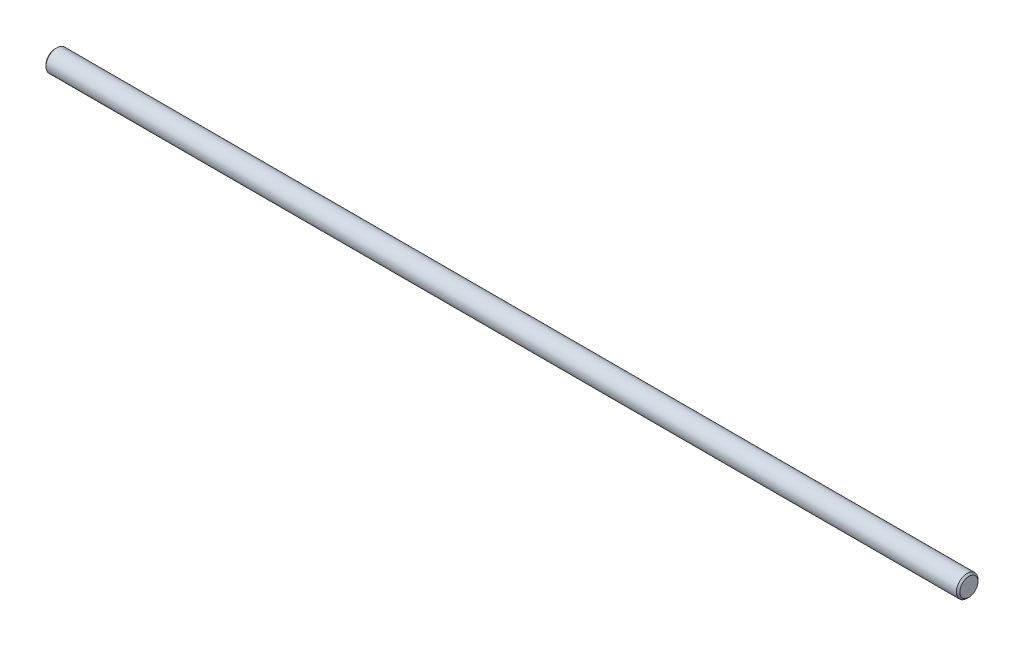
ISO-10303-21;
HEADER;
FILE_DESCRIPTION(('STEP AP214'),'2;1');
FILE_NAME('part.step','',(''),(''),'','','');
FILE_SCHEMA(('AUTOMOTIVE_DESIGN { 1 0 10303 214 1 1 1 1 }'));
ENDSEC;
DATA;
#1=APPLICATION_CONTEXT('core data for automotive mechanical design processes');
#2=APPLICATION_PROTOCOL_DEFINITION('international standard','automotive_design',2000,#1);
#3=PRODUCT_CONTEXT('',#1,'mechanical');
#4=PRODUCT('Part','Part','',(#3));
#5=PRODUCT_RELATED_PRODUCT_CATEGORY('part','',(#4));
#6=PRODUCT_DEFINITION_FORMATION('','',#4);
#7=PRODUCT_DEFINITION_CONTEXT('part definition',#1,'design');
#8=PRODUCT_DEFINITION('design','',#6,#7);
#9=PRODUCT_DEFINITION_SHAPE('','',#8);
#10=(LENGTH_UNIT() NAMED_UNIT(*) SI_UNIT(.MILLI.,.METRE.));
#11=(NAMED_UNIT(*) PLANE_ANGLE_UNIT() SI_UNIT($,.RADIAN.));
#12=(NAMED_UNIT(*) SI_UNIT($,.STERADIAN.) SOLID_ANGLE_UNIT());
#13=UNCERTAINTY_MEASURE_WITH_UNIT(LENGTH_MEASURE(1.E-05),#10,'distance_accuracy_value','');
#14=(GEOMETRIC_REPRESENTATION_CONTEXT(3) GLOBAL_UNCERTAINTY_ASSIGNED_CONTEXT((#13)) GLOBAL_UNIT_ASSIGNED_CONTEXT((#10,
#11,#12)) REPRESENTATION_CONTEXT('',''));
#15=CARTESIAN_POINT('',(0.,0.,0.));
#16=DIRECTION('',(0.,0.,1.));
#17=DIRECTION('',(1.,0.,0.));
#18=AXIS2_PLACEMENT_3D('',#15,#16,#17);
#19=CARTESIAN_POINT('',(268.,0.,0.));
#20=DIRECTION('',(-1.,0.,0.));
#21=DIRECTION('',(0.,0.,1.));
#22=AXIS2_PLACEMENT_3D('',#19,#20,#21);
#23=CYLINDRICAL_SURFACE('',#22,6.35);
#24=CARTESIAN_POINT('',(267.,0.,0.));
#25=DIRECTION('',(1.,0.,0.));
#26=DIRECTION('',(0.,0.,-1.));
#27=AXIS2_PLACEMENT_3D('',#24,#25,#26);
#28=CIRCLE('',#27,6.35);
#29=CARTESIAN_POINT('',(267.,0.,-6.35));
#30=VERTEX_POINT('',#29);
#31=EDGE_CURVE('E47',#30,#30,#28,.F.);
#32=ORIENTED_EDGE('',*,*,#31,.T.);
#33=EDGE_LOOP('',(#32));
#34=FACE_BOUND('',#33,.T.);
#35=CARTESIAN_POINT('',(-267.,0.,0.));
#36=DIRECTION('',(1.,0.,0.));
#37=DIRECTION('',(0.,0.,-1.));
#38=AXIS2_PLACEMENT_3D('',#35,#36,#37);
#39=CIRCLE('',#38,6.35);
#40=CARTESIAN_POINT('',(-267.,0.,-6.35));
#41=VERTEX_POINT('',#40);
#42=EDGE_CURVE('E51',#41,#41,#39,.T.);
#43=ORIENTED_EDGE('',*,*,#42,.T.);
#44=EDGE_LOOP('',(#43));
#45=FACE_BOUND('',#44,.T.);
#46=ADVANCED_FACE('F39',(#34,#45),#23,.T.);
#47=CARTESIAN_POINT('',(268.,0.,0.));
#48=DIRECTION('',(1.,0.,0.));
#49=DIRECTION('',(0.,0.,-1.));
#50=AXIS2_PLACEMENT_3D('',#47,#48,#49);
#51=PLANE('',#50);
#52=CARTESIAN_POINT('',(268.,0.,0.));
#53=DIRECTION('',(1.,0.,0.));
#54=DIRECTION('',(0.,0.,-1.));
#55=AXIS2_PLACEMENT_3D('',#52,#53,#54);
#56=CIRCLE('',#55,5.34999999999991);
#57=CARTESIAN_POINT('',(268.,0.,-5.34999999999991));
#58=VERTEX_POINT('',#57);
#59=EDGE_CURVE('E55',#58,#58,#56,.T.);
#60=ORIENTED_EDGE('',*,*,#59,.T.);
#61=EDGE_LOOP('',(#60));
#62=FACE_BOUND('',#61,.T.);
#63=ADVANCED_FACE('F61',(#62),#51,.T.);
#64=CARTESIAN_POINT('',(-268.,0.,0.));
#65=DIRECTION('',(1.,0.,0.));
#66=DIRECTION('',(0.,0.,-1.));
#67=AXIS2_PLACEMENT_3D('',#64,#65,#66);
#68=PLANE('',#67);
#69=CARTESIAN_POINT('',(-268.,0.,0.));
#70=DIRECTION('',(1.,0.,0.));
#71=DIRECTION('',(0.,0.,-1.));
#72=AXIS2_PLACEMENT_3D('',#69,#70,#71);
#73=CIRCLE('',#72,5.34999999999997);
#74=CARTESIAN_POINT('',(-268.,0.,-5.34999999999997));
#75=VERTEX_POINT('',#74);
#76=EDGE_CURVE('E10',#75,#75,#73,.F.);
#77=ORIENTED_EDGE('',*,*,#76,.T.);
#78=EDGE_LOOP('',(#77));
#79=FACE_BOUND('',#78,.T.);
#80=ADVANCED_FACE('F65',(#79),#68,.F.);
#81=CARTESIAN_POINT('',(268.,0.,0.));
#82=DIRECTION('',(-1.,0.,0.));
#83=DIRECTION('',(0.,0.,1.));
#84=AXIS2_PLACEMENT_3D('',#81,#82,#83);
#85=CONICAL_SURFACE('',#84,5.34999999999991,0.785398163397465);
#86=ORIENTED_EDGE('',*,*,#31,.F.);
#87=EDGE_LOOP('',(#86));
#88=FACE_BOUND('',#87,.T.);
#89=ORIENTED_EDGE('',*,*,#59,.F.);
#90=EDGE_LOOP('',(#89));
#91=FACE_BOUND('',#90,.T.);
#92=ADVANCED_FACE('F63',(#88,#91),#85,.T.);
#93=CARTESIAN_POINT('',(-267.,0.,0.));
#94=DIRECTION('',(1.,0.,0.));
#95=DIRECTION('',(0.,0.,-1.));
#96=AXIS2_PLACEMENT_3D('',#93,#94,#95);
#97=CONICAL_SURFACE('',#96,6.35,0.785398163397465);
#98=ORIENTED_EDGE('',*,*,#76,.F.);
#99=EDGE_LOOP('',(#98));
#100=FACE_BOUND('',#99,.T.);
#101=ORIENTED_EDGE('',*,*,#42,.F.);
#102=EDGE_LOOP('',(#101));
#103=FACE_BOUND('',#102,.T.);
#104=ADVANCED_FACE('F42',(#100,#103),#97,.T.);
#105=CLOSED_SHELL('',(#46,#63,#80,#92,#104));
#106=MANIFOLD_SOLID_BREP('B2',#105);
#107=ADVANCED_BREP_SHAPE_REPRESENTATION('',(#18,#106),#14);
#108=SHAPE_DEFINITION_REPRESENTATION(#9,#107);
ENDSEC;
END-ISO-10303-21;
